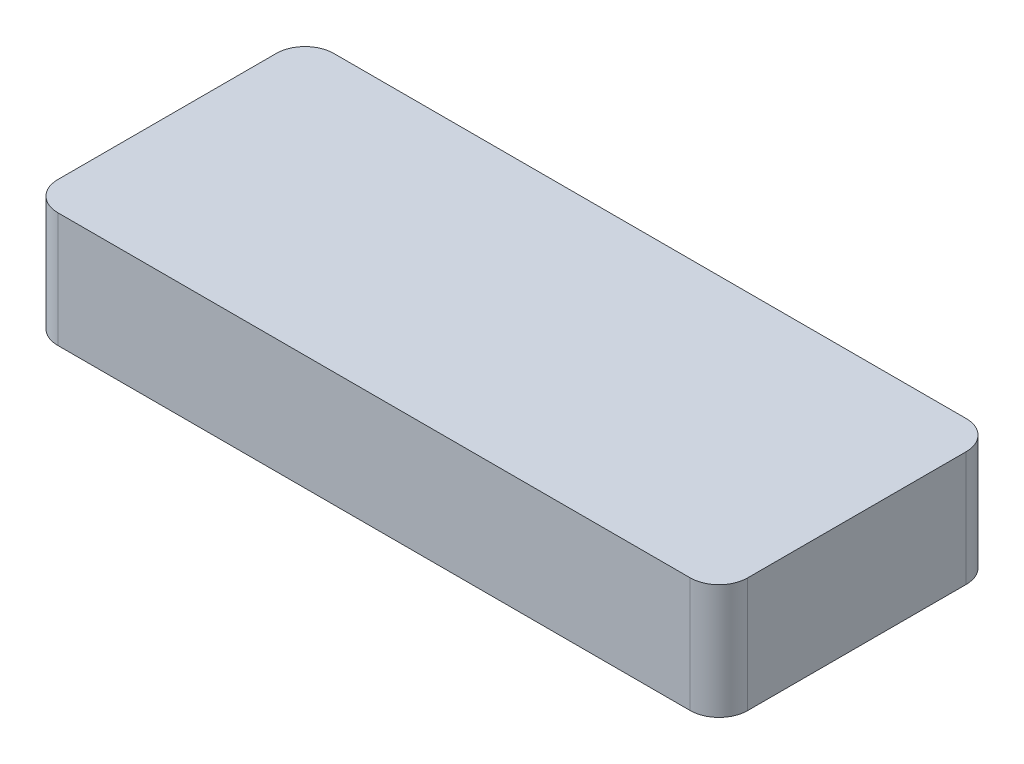
ISO-10303-21;
HEADER;
FILE_DESCRIPTION(('STEP AP214'),'2;1');
FILE_NAME('part.step','',(''),(''),'','','');
FILE_SCHEMA(('AUTOMOTIVE_DESIGN { 1 0 10303 214 1 1 1 1 }'));
ENDSEC;
DATA;
#1=APPLICATION_CONTEXT('core data for automotive mechanical design processes');
#2=APPLICATION_PROTOCOL_DEFINITION('international standard','automotive_design',2000,#1);
#3=PRODUCT_CONTEXT('',#1,'mechanical');
#4=PRODUCT('Part','Part','',(#3));
#5=PRODUCT_RELATED_PRODUCT_CATEGORY('part','',(#4));
#6=PRODUCT_DEFINITION_FORMATION('','',#4);
#7=PRODUCT_DEFINITION_CONTEXT('part definition',#1,'design');
#8=PRODUCT_DEFINITION('design','',#6,#7);
#9=PRODUCT_DEFINITION_SHAPE('','',#8);
#10=(LENGTH_UNIT() NAMED_UNIT(*) SI_UNIT(.MILLI.,.METRE.));
#11=(NAMED_UNIT(*) PLANE_ANGLE_UNIT() SI_UNIT($,.RADIAN.));
#12=(NAMED_UNIT(*) SI_UNIT($,.STERADIAN.) SOLID_ANGLE_UNIT());
#13=UNCERTAINTY_MEASURE_WITH_UNIT(LENGTH_MEASURE(1.E-05),#10,'distance_accuracy_value','');
#14=(GEOMETRIC_REPRESENTATION_CONTEXT(3) GLOBAL_UNCERTAINTY_ASSIGNED_CONTEXT((#13)) GLOBAL_UNIT_ASSIGNED_CONTEXT((#10,
#11,#12)) REPRESENTATION_CONTEXT('',''));
#15=CARTESIAN_POINT('',(0.,0.,0.));
#16=DIRECTION('',(0.,0.,1.));
#17=DIRECTION('',(1.,0.,0.));
#18=AXIS2_PLACEMENT_3D('',#15,#16,#17);
#19=CARTESIAN_POINT('',(0.,2.54,0.));
#20=DIRECTION('',(-1.,0.,0.));
#21=DIRECTION('',(0.,0.,1.));
#22=AXIS2_PLACEMENT_3D('',#19,#20,#21);
#23=PLANE('',#22);
#24=DIRECTION('',(0.,0.,-1.));
#25=VECTOR('',#24,1.);
#26=CARTESIAN_POINT('',(0.,2.54,0.));
#27=LINE('',#26,#25);
#28=CARTESIAN_POINT('',(0.,2.54,-0.635000000000001));
#29=VERTEX_POINT('',#28);
#30=CARTESIAN_POINT('',(0.,2.54,-5.461));
#31=VERTEX_POINT('',#30);
#32=EDGE_CURVE('E167',#29,#31,#27,.T.);
#33=ORIENTED_EDGE('',*,*,#32,.T.);
#34=DIRECTION('',(0.,-1.,0.));
#35=VECTOR('',#34,1.);
#36=CARTESIAN_POINT('',(0.,2.54,-5.461));
#37=LINE('',#36,#35);
#38=CARTESIAN_POINT('',(0.,0.,-5.461));
#39=VERTEX_POINT('',#38);
#40=EDGE_CURVE('E11',#31,#39,#37,.T.);
#41=ORIENTED_EDGE('',*,*,#40,.T.);
#42=DIRECTION('',(0.,0.,-1.));
#43=VECTOR('',#42,1.);
#44=CARTESIAN_POINT('',(0.,0.,0.));
#45=LINE('',#44,#43);
#46=CARTESIAN_POINT('',(0.,0.,-0.635000000000001));
#47=VERTEX_POINT('',#46);
#48=EDGE_CURVE('E134',#47,#39,#45,.T.);
#49=ORIENTED_EDGE('',*,*,#48,.F.);
#50=DIRECTION('',(0.,-1.,0.));
#51=VECTOR('',#50,1.);
#52=CARTESIAN_POINT('',(0.,2.54,-0.635000000000001));
#53=LINE('',#52,#51);
#54=EDGE_CURVE('E40',#47,#29,#53,.F.);
#55=ORIENTED_EDGE('',*,*,#54,.T.);
#56=EDGE_LOOP('',(#33,#41,#49,#55));
#57=FACE_BOUND('',#56,.T.);
#58=ADVANCED_FACE('F32',(#57),#23,.T.);
#59=CARTESIAN_POINT('',(15.24,2.54,0.));
#60=DIRECTION('',(0.,0.,1.));
#61=DIRECTION('',(1.,0.,0.));
#62=AXIS2_PLACEMENT_3D('',#59,#60,#61);
#63=PLANE('',#62);
#64=DIRECTION('',(-1.,0.,0.));
#65=VECTOR('',#64,1.);
#66=CARTESIAN_POINT('',(15.24,0.,0.));
#67=LINE('',#66,#65);
#68=CARTESIAN_POINT('',(14.605,0.,0.));
#69=VERTEX_POINT('',#68);
#70=CARTESIAN_POINT('',(0.635,0.,0.));
#71=VERTEX_POINT('',#70);
#72=EDGE_CURVE('E171',#69,#71,#67,.T.);
#73=ORIENTED_EDGE('',*,*,#72,.F.);
#74=DIRECTION('',(0.,-1.,0.));
#75=VECTOR('',#74,1.);
#76=CARTESIAN_POINT('',(14.605,2.54,0.));
#77=LINE('',#76,#75);
#78=CARTESIAN_POINT('',(14.605,2.54,0.));
#79=VERTEX_POINT('',#78);
#80=EDGE_CURVE('E54',#69,#79,#77,.F.);
#81=ORIENTED_EDGE('',*,*,#80,.T.);
#82=DIRECTION('',(-1.,0.,0.));
#83=VECTOR('',#82,1.);
#84=CARTESIAN_POINT('',(15.24,2.54,0.));
#85=LINE('',#84,#83);
#86=CARTESIAN_POINT('',(0.635,2.54,0.));
#87=VERTEX_POINT('',#86);
#88=EDGE_CURVE('E177',#79,#87,#85,.T.);
#89=ORIENTED_EDGE('',*,*,#88,.T.);
#90=DIRECTION('',(0.,-1.,0.));
#91=VECTOR('',#90,1.);
#92=CARTESIAN_POINT('',(0.635,2.54,0.));
#93=LINE('',#92,#91);
#94=EDGE_CURVE('E214',#87,#71,#93,.T.);
#95=ORIENTED_EDGE('',*,*,#94,.T.);
#96=EDGE_LOOP('',(#73,#81,#89,#95));
#97=FACE_BOUND('',#96,.T.);
#98=ADVANCED_FACE('F227',(#97),#63,.T.);
#99=CARTESIAN_POINT('',(15.24,2.54,-6.096));
#100=DIRECTION('',(1.,0.,0.));
#101=DIRECTION('',(0.,0.,-1.));
#102=AXIS2_PLACEMENT_3D('',#99,#100,#101);
#103=PLANE('',#102);
#104=DIRECTION('',(0.,0.,1.));
#105=VECTOR('',#104,1.);
#106=CARTESIAN_POINT('',(15.24,0.,-6.096));
#107=LINE('',#106,#105);
#108=CARTESIAN_POINT('',(15.24,0.,-5.461));
#109=VERTEX_POINT('',#108);
#110=CARTESIAN_POINT('',(15.24,0.,-0.634999999999998));
#111=VERTEX_POINT('',#110);
#112=EDGE_CURVE('E185',#109,#111,#107,.T.);
#113=ORIENTED_EDGE('',*,*,#112,.F.);
#114=DIRECTION('',(0.,-1.,0.));
#115=VECTOR('',#114,1.);
#116=CARTESIAN_POINT('',(15.24,2.54,-5.461));
#117=LINE('',#116,#115);
#118=CARTESIAN_POINT('',(15.24,2.54,-5.461));
#119=VERTEX_POINT('',#118);
#120=EDGE_CURVE('E205',#109,#119,#117,.F.);
#121=ORIENTED_EDGE('',*,*,#120,.T.);
#122=DIRECTION('',(0.,0.,1.));
#123=VECTOR('',#122,1.);
#124=CARTESIAN_POINT('',(15.24,2.54,-6.096));
#125=LINE('',#124,#123);
#126=CARTESIAN_POINT('',(15.24,2.54,-0.634999999999998));
#127=VERTEX_POINT('',#126);
#128=EDGE_CURVE('E174',#119,#127,#125,.T.);
#129=ORIENTED_EDGE('',*,*,#128,.T.);
#130=DIRECTION('',(0.,-1.,0.));
#131=VECTOR('',#130,1.);
#132=CARTESIAN_POINT('',(15.24,2.54,-0.634999999999998));
#133=LINE('',#132,#131);
#134=EDGE_CURVE('E202',#127,#111,#133,.T.);
#135=ORIENTED_EDGE('',*,*,#134,.T.);
#136=EDGE_LOOP('',(#113,#121,#129,#135));
#137=FACE_BOUND('',#136,.T.);
#138=ADVANCED_FACE('F236',(#137),#103,.T.);
#139=CARTESIAN_POINT('',(0.,2.54,-6.096));
#140=DIRECTION('',(0.,0.,-1.));
#141=DIRECTION('',(-1.,0.,0.));
#142=AXIS2_PLACEMENT_3D('',#139,#140,#141);
#143=PLANE('',#142);
#144=DIRECTION('',(1.,0.,0.));
#145=VECTOR('',#144,1.);
#146=CARTESIAN_POINT('',(0.,2.54,-6.096));
#147=LINE('',#146,#145);
#148=CARTESIAN_POINT('',(0.635000000000006,2.54,-6.096));
#149=VERTEX_POINT('',#148);
#150=CARTESIAN_POINT('',(14.605,2.54,-6.096));
#151=VERTEX_POINT('',#150);
#152=EDGE_CURVE('E170',#149,#151,#147,.T.);
#153=ORIENTED_EDGE('',*,*,#152,.T.);
#154=DIRECTION('',(0.,-1.,0.));
#155=VECTOR('',#154,1.);
#156=CARTESIAN_POINT('',(14.605,2.54,-6.096));
#157=LINE('',#156,#155);
#158=CARTESIAN_POINT('',(14.605,0.,-6.096));
#159=VERTEX_POINT('',#158);
#160=EDGE_CURVE('E191',#151,#159,#157,.T.);
#161=ORIENTED_EDGE('',*,*,#160,.T.);
#162=DIRECTION('',(1.,0.,0.));
#163=VECTOR('',#162,1.);
#164=CARTESIAN_POINT('',(0.,0.,-6.096));
#165=LINE('',#164,#163);
#166=CARTESIAN_POINT('',(0.635000000000006,0.,-6.096));
#167=VERTEX_POINT('',#166);
#168=EDGE_CURVE('E182',#167,#159,#165,.T.);
#169=ORIENTED_EDGE('',*,*,#168,.F.);
#170=DIRECTION('',(0.,-1.,0.));
#171=VECTOR('',#170,1.);
#172=CARTESIAN_POINT('',(0.635000000000006,2.54,-6.096));
#173=LINE('',#172,#171);
#174=EDGE_CURVE('E179',#167,#149,#173,.F.);
#175=ORIENTED_EDGE('',*,*,#174,.T.);
#176=EDGE_LOOP('',(#153,#161,#169,#175));
#177=FACE_BOUND('',#176,.T.);
#178=ADVANCED_FACE('F244',(#177),#143,.T.);
#179=CARTESIAN_POINT('',(0.,2.54,0.));
#180=DIRECTION('',(0.,-1.,0.));
#181=DIRECTION('',(0.,0.,-1.));
#182=AXIS2_PLACEMENT_3D('',#179,#180,#181);
#183=PLANE('',#182);
#184=ORIENTED_EDGE('',*,*,#128,.F.);
#185=CARTESIAN_POINT('',(14.605,2.54,-5.461));
#186=DIRECTION('',(0.,-1.,0.));
#187=DIRECTION('',(0.,0.,-1.));
#188=AXIS2_PLACEMENT_3D('',#185,#186,#187);
#189=CIRCLE('',#188,0.635);
#190=EDGE_CURVE('E212',#119,#151,#189,.F.);
#191=ORIENTED_EDGE('',*,*,#190,.T.);
#192=ORIENTED_EDGE('',*,*,#152,.F.);
#193=CARTESIAN_POINT('',(0.635000000000006,2.54,-5.461));
#194=DIRECTION('',(0.,-1.,0.));
#195=DIRECTION('',(0.,0.,-1.));
#196=AXIS2_PLACEMENT_3D('',#193,#194,#195);
#197=CIRCLE('',#196,0.635);
#198=EDGE_CURVE('E208',#149,#31,#197,.F.);
#199=ORIENTED_EDGE('',*,*,#198,.T.);
#200=ORIENTED_EDGE('',*,*,#32,.F.);
#201=CARTESIAN_POINT('',(0.635,2.54,-0.635));
#202=DIRECTION('',(0.,-1.,0.));
#203=DIRECTION('',(0.,0.,-1.));
#204=AXIS2_PLACEMENT_3D('',#201,#202,#203);
#205=CIRCLE('',#204,0.635);
#206=EDGE_CURVE('E47',#29,#87,#205,.F.);
#207=ORIENTED_EDGE('',*,*,#206,.T.);
#208=ORIENTED_EDGE('',*,*,#88,.F.);
#209=CARTESIAN_POINT('',(14.605,2.54,-0.635));
#210=DIRECTION('',(0.,-1.,0.));
#211=DIRECTION('',(0.,0.,-1.));
#212=AXIS2_PLACEMENT_3D('',#209,#210,#211);
#213=CIRCLE('',#212,0.635);
#214=EDGE_CURVE('E210',#79,#127,#213,.F.);
#215=ORIENTED_EDGE('',*,*,#214,.T.);
#216=EDGE_LOOP('',(#184,#191,#192,#199,#200,#207,#208,#215));
#217=FACE_BOUND('',#216,.T.);
#218=ADVANCED_FACE('F223',(#217),#183,.F.);
#219=CARTESIAN_POINT('',(0.,0.,0.));
#220=DIRECTION('',(0.,-1.,0.));
#221=DIRECTION('',(0.,0.,-1.));
#222=AXIS2_PLACEMENT_3D('',#219,#220,#221);
#223=PLANE('',#222);
#224=DIRECTION('',(0.,0.,-1.));
#225=VECTOR('',#224,1.);
#226=CARTESIAN_POINT('',(0.635,0.,0.));
#227=LINE('',#226,#225);
#228=CARTESIAN_POINT('',(0.635000000000001,0.,-0.635));
#229=VERTEX_POINT('',#228);
#230=CARTESIAN_POINT('',(0.635000000000006,0.,-5.461));
#231=VERTEX_POINT('',#230);
#232=EDGE_CURVE('E158',#229,#231,#227,.T.);
#233=ORIENTED_EDGE('',*,*,#232,.F.);
#234=DIRECTION('',(-1.,0.,0.));
#235=VECTOR('',#234,1.);
#236=CARTESIAN_POINT('',(0.,0.,-0.635));
#237=LINE('',#236,#235);
#238=CARTESIAN_POINT('',(14.605,0.,-0.635));
#239=VERTEX_POINT('',#238);
#240=EDGE_CURVE('E130',#239,#229,#237,.T.);
#241=ORIENTED_EDGE('',*,*,#240,.F.);
#242=DIRECTION('',(0.,0.,1.));
#243=VECTOR('',#242,1.);
#244=CARTESIAN_POINT('',(14.605,0.,0.));
#245=LINE('',#244,#243);
#246=CARTESIAN_POINT('',(14.605,0.,-5.461));
#247=VERTEX_POINT('',#246);
#248=EDGE_CURVE('E164',#247,#239,#245,.T.);
#249=ORIENTED_EDGE('',*,*,#248,.F.);
#250=DIRECTION('',(1.,0.,0.));
#251=VECTOR('',#250,1.);
#252=CARTESIAN_POINT('',(0.,0.,-5.461));
#253=LINE('',#252,#251);
#254=EDGE_CURVE('E160',#231,#247,#253,.T.);
#255=ORIENTED_EDGE('',*,*,#254,.F.);
#256=EDGE_LOOP('',(#233,#241,#249,#255));
#257=FACE_BOUND('',#256,.T.);
#258=ORIENTED_EDGE('',*,*,#168,.T.);
#259=CARTESIAN_POINT('',(14.605,0.,-5.461));
#260=DIRECTION('',(0.,-1.,0.));
#261=DIRECTION('',(0.,0.,-1.));
#262=AXIS2_PLACEMENT_3D('',#259,#260,#261);
#263=CIRCLE('',#262,0.635);
#264=EDGE_CURVE('E200',#159,#109,#263,.T.);
#265=ORIENTED_EDGE('',*,*,#264,.T.);
#266=ORIENTED_EDGE('',*,*,#112,.T.);
#267=CARTESIAN_POINT('',(14.605,0.,-0.635));
#268=DIRECTION('',(0.,-1.,0.));
#269=DIRECTION('',(0.,0.,-1.));
#270=AXIS2_PLACEMENT_3D('',#267,#268,#269);
#271=CIRCLE('',#270,0.635);
#272=EDGE_CURVE('E198',#111,#69,#271,.T.);
#273=ORIENTED_EDGE('',*,*,#272,.T.);
#274=ORIENTED_EDGE('',*,*,#72,.T.);
#275=CARTESIAN_POINT('',(0.635,0.,-0.635));
#276=DIRECTION('',(0.,-1.,0.));
#277=DIRECTION('',(0.,0.,-1.));
#278=AXIS2_PLACEMENT_3D('',#275,#276,#277);
#279=CIRCLE('',#278,0.635);
#280=EDGE_CURVE('E194',#71,#47,#279,.T.);
#281=ORIENTED_EDGE('',*,*,#280,.T.);
#282=ORIENTED_EDGE('',*,*,#48,.T.);
#283=CARTESIAN_POINT('',(0.635000000000006,0.,-5.461));
#284=DIRECTION('',(0.,-1.,0.));
#285=DIRECTION('',(0.,0.,-1.));
#286=AXIS2_PLACEMENT_3D('',#283,#284,#285);
#287=CIRCLE('',#286,0.635);
#288=EDGE_CURVE('E196',#39,#167,#287,.T.);
#289=ORIENTED_EDGE('',*,*,#288,.T.);
#290=EDGE_LOOP('',(#258,#265,#266,#273,#274,#281,#282,#289));
#291=FACE_BOUND('',#290,.T.);
#292=ADVANCED_FACE('F229',(#257,#291),#223,.T.);
#293=CARTESIAN_POINT('',(0.635,2.54,0.));
#294=DIRECTION('',(-1.,0.,0.));
#295=DIRECTION('',(0.,0.,1.));
#296=AXIS2_PLACEMENT_3D('',#293,#294,#295);
#297=PLANE('',#296);
#298=ORIENTED_EDGE('',*,*,#232,.T.);
#299=DIRECTION('',(0.,-1.,0.));
#300=VECTOR('',#299,1.);
#301=CARTESIAN_POINT('',(0.635000000000006,2.54,-5.461));
#302=LINE('',#301,#300);
#303=CARTESIAN_POINT('',(0.635000000000006,1.905,-5.461));
#304=VERTEX_POINT('',#303);
#305=EDGE_CURVE('E140',#304,#231,#302,.T.);
#306=ORIENTED_EDGE('',*,*,#305,.F.);
#307=DIRECTION('',(0.,0.,-1.));
#308=VECTOR('',#307,1.);
#309=CARTESIAN_POINT('',(0.635,1.905,0.));
#310=LINE('',#309,#308);
#311=CARTESIAN_POINT('',(0.635000000000001,1.905,-0.635));
#312=VERTEX_POINT('',#311);
#313=EDGE_CURVE('E138',#312,#304,#310,.T.);
#314=ORIENTED_EDGE('',*,*,#313,.F.);
#315=DIRECTION('',(0.,-1.,0.));
#316=VECTOR('',#315,1.);
#317=CARTESIAN_POINT('',(0.635,2.54,-0.635));
#318=LINE('',#317,#316);
#319=EDGE_CURVE('E123',#312,#229,#318,.T.);
#320=ORIENTED_EDGE('',*,*,#319,.T.);
#321=EDGE_LOOP('',(#298,#306,#314,#320));
#322=FACE_BOUND('',#321,.T.);
#323=ADVANCED_FACE('F139',(#322),#297,.F.);
#324=CARTESIAN_POINT('',(15.24,2.54,-0.635));
#325=DIRECTION('',(0.,0.,1.));
#326=DIRECTION('',(1.,0.,0.));
#327=AXIS2_PLACEMENT_3D('',#324,#325,#326);
#328=PLANE('',#327);
#329=ORIENTED_EDGE('',*,*,#240,.T.);
#330=ORIENTED_EDGE('',*,*,#319,.F.);
#331=DIRECTION('',(-1.,0.,0.));
#332=VECTOR('',#331,1.);
#333=CARTESIAN_POINT('',(0.,1.905,-0.635));
#334=LINE('',#333,#332);
#335=CARTESIAN_POINT('',(14.605,1.905,-0.635));
#336=VERTEX_POINT('',#335);
#337=EDGE_CURVE('E128',#336,#312,#334,.T.);
#338=ORIENTED_EDGE('',*,*,#337,.F.);
#339=DIRECTION('',(0.,-1.,0.));
#340=VECTOR('',#339,1.);
#341=CARTESIAN_POINT('',(14.605,2.54,-0.635));
#342=LINE('',#341,#340);
#343=EDGE_CURVE('E135',#336,#239,#342,.T.);
#344=ORIENTED_EDGE('',*,*,#343,.T.);
#345=EDGE_LOOP('',(#329,#330,#338,#344));
#346=FACE_BOUND('',#345,.T.);
#347=ADVANCED_FACE('F125',(#346),#328,.F.);
#348=CARTESIAN_POINT('',(14.605,2.54,-6.096));
#349=DIRECTION('',(1.,0.,0.));
#350=DIRECTION('',(0.,0.,-1.));
#351=AXIS2_PLACEMENT_3D('',#348,#349,#350);
#352=PLANE('',#351);
#353=ORIENTED_EDGE('',*,*,#248,.T.);
#354=ORIENTED_EDGE('',*,*,#343,.F.);
#355=DIRECTION('',(0.,0.,1.));
#356=VECTOR('',#355,1.);
#357=CARTESIAN_POINT('',(14.605,1.905,0.));
#358=LINE('',#357,#356);
#359=CARTESIAN_POINT('',(14.605,1.905,-5.461));
#360=VERTEX_POINT('',#359);
#361=EDGE_CURVE('E149',#360,#336,#358,.T.);
#362=ORIENTED_EDGE('',*,*,#361,.F.);
#363=DIRECTION('',(0.,-1.,0.));
#364=VECTOR('',#363,1.);
#365=CARTESIAN_POINT('',(14.605,2.54,-5.461));
#366=LINE('',#365,#364);
#367=EDGE_CURVE('E151',#360,#247,#366,.T.);
#368=ORIENTED_EDGE('',*,*,#367,.T.);
#369=EDGE_LOOP('',(#353,#354,#362,#368));
#370=FACE_BOUND('',#369,.T.);
#371=ADVANCED_FACE('F274',(#370),#352,.F.);
#372=CARTESIAN_POINT('',(0.,2.54,-5.461));
#373=DIRECTION('',(0.,0.,-1.));
#374=DIRECTION('',(-1.,0.,0.));
#375=AXIS2_PLACEMENT_3D('',#372,#373,#374);
#376=PLANE('',#375);
#377=ORIENTED_EDGE('',*,*,#254,.T.);
#378=ORIENTED_EDGE('',*,*,#367,.F.);
#379=DIRECTION('',(1.,0.,0.));
#380=VECTOR('',#379,1.);
#381=CARTESIAN_POINT('',(0.,1.905,-5.461));
#382=LINE('',#381,#380);
#383=EDGE_CURVE('E144',#304,#360,#382,.T.);
#384=ORIENTED_EDGE('',*,*,#383,.F.);
#385=ORIENTED_EDGE('',*,*,#305,.T.);
#386=EDGE_LOOP('',(#377,#378,#384,#385));
#387=FACE_BOUND('',#386,.T.);
#388=ADVANCED_FACE('F268',(#387),#376,.F.);
#389=CARTESIAN_POINT('',(0.,1.905,0.));
#390=DIRECTION('',(0.,-1.,0.));
#391=DIRECTION('',(0.,0.,-1.));
#392=AXIS2_PLACEMENT_3D('',#389,#390,#391);
#393=PLANE('',#392);
#394=CARTESIAN_POINT('',(7.62,1.905,-3.048));
#395=DIRECTION('',(0.,-1.,0.));
#396=DIRECTION('',(0.,0.,-1.));
#397=AXIS2_PLACEMENT_3D('',#394,#395,#396);
#398=CIRCLE('',#397,1.5875);
#399=CARTESIAN_POINT('',(7.62,1.905,-4.6355));
#400=VERTEX_POINT('',#399);
#401=EDGE_CURVE('E395',#400,#400,#398,.T.);
#402=ORIENTED_EDGE('',*,*,#401,.F.);
#403=EDGE_LOOP('',(#402));
#404=FACE_BOUND('',#403,.T.);
#405=ORIENTED_EDGE('',*,*,#313,.T.);
#406=ORIENTED_EDGE('',*,*,#383,.T.);
#407=ORIENTED_EDGE('',*,*,#361,.T.);
#408=ORIENTED_EDGE('',*,*,#337,.T.);
#409=EDGE_LOOP('',(#405,#406,#407,#408));
#410=FACE_BOUND('',#409,.T.);
#411=ADVANCED_FACE('F147',(#404,#410),#393,.T.);
#412=CARTESIAN_POINT('',(14.605,2.54,-5.461));
#413=DIRECTION('',(0.,-1.,0.));
#414=DIRECTION('',(0.,0.,-1.));
#415=AXIS2_PLACEMENT_3D('',#412,#413,#414);
#416=CYLINDRICAL_SURFACE('',#415,0.635);
#417=ORIENTED_EDGE('',*,*,#190,.F.);
#418=ORIENTED_EDGE('',*,*,#120,.F.);
#419=ORIENTED_EDGE('',*,*,#264,.F.);
#420=ORIENTED_EDGE('',*,*,#160,.F.);
#421=EDGE_LOOP('',(#417,#418,#419,#420));
#422=FACE_BOUND('',#421,.T.);
#423=ADVANCED_FACE('F241',(#422),#416,.T.);
#424=CARTESIAN_POINT('',(14.605,2.54,-0.635));
#425=DIRECTION('',(0.,-1.,0.));
#426=DIRECTION('',(0.,0.,-1.));
#427=AXIS2_PLACEMENT_3D('',#424,#425,#426);
#428=CYLINDRICAL_SURFACE('',#427,0.635);
#429=ORIENTED_EDGE('',*,*,#214,.F.);
#430=ORIENTED_EDGE('',*,*,#80,.F.);
#431=ORIENTED_EDGE('',*,*,#272,.F.);
#432=ORIENTED_EDGE('',*,*,#134,.F.);
#433=EDGE_LOOP('',(#429,#430,#431,#432));
#434=FACE_BOUND('',#433,.T.);
#435=ADVANCED_FACE('F234',(#434),#428,.T.);
#436=CARTESIAN_POINT('',(0.635000000000006,2.54,-5.461));
#437=DIRECTION('',(0.,-1.,0.));
#438=DIRECTION('',(0.,0.,-1.));
#439=AXIS2_PLACEMENT_3D('',#436,#437,#438);
#440=CYLINDRICAL_SURFACE('',#439,0.635);
#441=ORIENTED_EDGE('',*,*,#198,.F.);
#442=ORIENTED_EDGE('',*,*,#174,.F.);
#443=ORIENTED_EDGE('',*,*,#288,.F.);
#444=ORIENTED_EDGE('',*,*,#40,.F.);
#445=EDGE_LOOP('',(#441,#442,#443,#444));
#446=FACE_BOUND('',#445,.T.);
#447=ADVANCED_FACE('F247',(#446),#440,.T.);
#448=CARTESIAN_POINT('',(0.635,2.54,-0.635));
#449=DIRECTION('',(0.,-1.,0.));
#450=DIRECTION('',(0.,0.,-1.));
#451=AXIS2_PLACEMENT_3D('',#448,#449,#450);
#452=CYLINDRICAL_SURFACE('',#451,0.635);
#453=ORIENTED_EDGE('',*,*,#206,.F.);
#454=ORIENTED_EDGE('',*,*,#54,.F.);
#455=ORIENTED_EDGE('',*,*,#280,.F.);
#456=ORIENTED_EDGE('',*,*,#94,.F.);
#457=EDGE_LOOP('',(#453,#454,#455,#456));
#458=FACE_BOUND('',#457,.T.);
#459=ADVANCED_FACE('F34',(#458),#452,.T.);
#460=CARTESIAN_POINT('',(7.62,-4.49012806053458,-3.048));
#461=DIRECTION('',(0.,1.,0.));
#462=DIRECTION('',(0.,0.,1.));
#463=AXIS2_PLACEMENT_3D('',#460,#461,#462);
#464=CYLINDRICAL_SURFACE('',#463,1.5875);
#465=ORIENTED_EDGE('',*,*,#401,.T.);
#466=EDGE_LOOP('',(#465));
#467=FACE_BOUND('',#466,.T.);
#468=CARTESIAN_POINT('',(7.62,0.,-3.048));
#469=DIRECTION('',(0.,-1.,0.));
#470=DIRECTION('',(0.,0.,-1.));
#471=AXIS2_PLACEMENT_3D('',#468,#469,#470);
#472=CIRCLE('',#471,1.5875);
#473=CARTESIAN_POINT('',(7.62,0.,-4.6355));
#474=VERTEX_POINT('',#473);
#475=EDGE_CURVE('E161',#474,#474,#472,.T.);
#476=ORIENTED_EDGE('',*,*,#475,.F.);
#477=EDGE_LOOP('',(#476));
#478=FACE_BOUND('',#477,.T.);
#479=ADVANCED_FACE('F253',(#467,#478),#464,.T.);
#480=CARTESIAN_POINT('',(0.,0.,0.));
#481=DIRECTION('',(0.,-1.,0.));
#482=DIRECTION('',(0.,0.,-1.));
#483=AXIS2_PLACEMENT_3D('',#480,#481,#482);
#484=PLANE('',#483);
#485=ORIENTED_EDGE('',*,*,#475,.T.);
#486=EDGE_LOOP('',(#485));
#487=FACE_BOUND('',#486,.T.);
#488=ADVANCED_FACE('F378',(#487),#484,.T.);
#489=CLOSED_SHELL('',(#58,#98,#138,#178,#218,#292,#323,#347,#371,#388,#411,#423,#435,#447,#459,
#479,#488));
#490=MANIFOLD_SOLID_BREP('B2',#489);
#491=ADVANCED_BREP_SHAPE_REPRESENTATION('',(#18,#490),#14);
#492=SHAPE_DEFINITION_REPRESENTATION(#9,#491);
ENDSEC;
END-ISO-10303-21;
